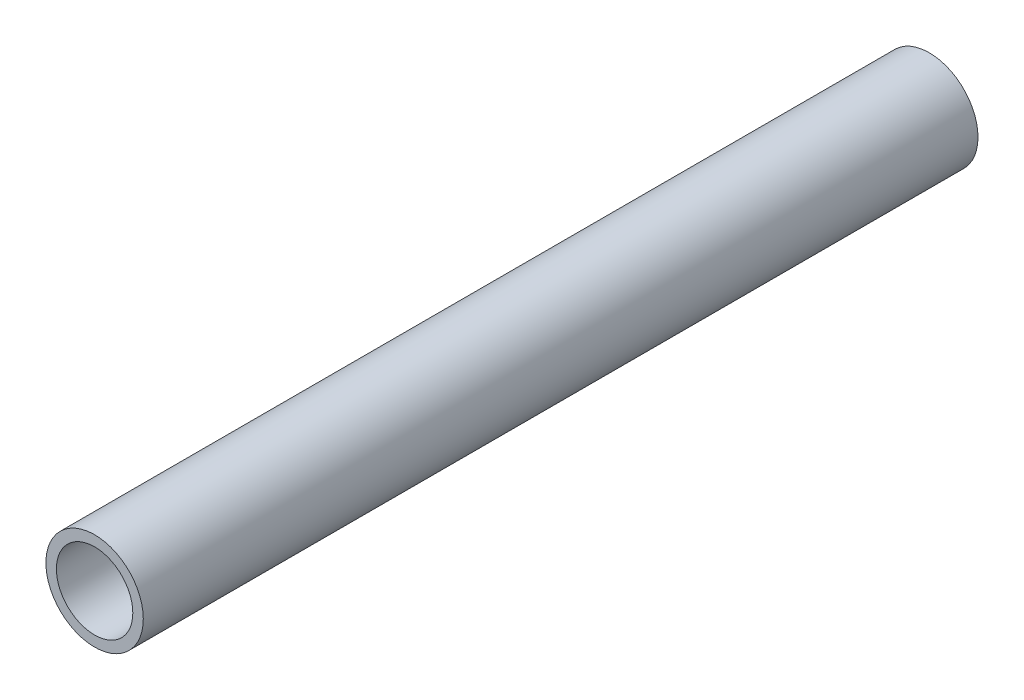
ISO-10303-21;
HEADER;
FILE_DESCRIPTION(('STEP AP214'),'2;1');
FILE_NAME('part.step','',(''),(''),'','','');
FILE_SCHEMA(('AUTOMOTIVE_DESIGN { 1 0 10303 214 1 1 1 1 }'));
ENDSEC;
DATA;
#1=APPLICATION_CONTEXT('core data for automotive mechanical design processes');
#2=APPLICATION_PROTOCOL_DEFINITION('international standard','automotive_design',2000,#1);
#3=PRODUCT_CONTEXT('',#1,'mechanical');
#4=PRODUCT('Part','Part','',(#3));
#5=PRODUCT_RELATED_PRODUCT_CATEGORY('part','',(#4));
#6=PRODUCT_DEFINITION_FORMATION('','',#4);
#7=PRODUCT_DEFINITION_CONTEXT('part definition',#1,'design');
#8=PRODUCT_DEFINITION('design','',#6,#7);
#9=PRODUCT_DEFINITION_SHAPE('','',#8);
#10=(LENGTH_UNIT() NAMED_UNIT(*) SI_UNIT(.MILLI.,.METRE.));
#11=(NAMED_UNIT(*) PLANE_ANGLE_UNIT() SI_UNIT($,.RADIAN.));
#12=(NAMED_UNIT(*) SI_UNIT($,.STERADIAN.) SOLID_ANGLE_UNIT());
#13=UNCERTAINTY_MEASURE_WITH_UNIT(LENGTH_MEASURE(1.E-05),#10,'distance_accuracy_value','');
#14=(GEOMETRIC_REPRESENTATION_CONTEXT(3) GLOBAL_UNCERTAINTY_ASSIGNED_CONTEXT((#13)) GLOBAL_UNIT_ASSIGNED_CONTEXT((#10,
#11,#12)) REPRESENTATION_CONTEXT('',''));
#15=CARTESIAN_POINT('',(0.,0.,0.));
#16=DIRECTION('',(0.,0.,1.));
#17=DIRECTION('',(1.,0.,0.));
#18=AXIS2_PLACEMENT_3D('',#15,#16,#17);
#19=CARTESIAN_POINT('',(0.,0.,228.6));
#20=DIRECTION('',(0.,0.,1.));
#21=DIRECTION('',(1.,0.,0.));
#22=AXIS2_PLACEMENT_3D('',#19,#20,#21);
#23=PLANE('',#22);
#24=CARTESIAN_POINT('',(0.,0.,228.6));
#25=DIRECTION('',(0.,0.,1.));
#26=DIRECTION('',(1.,0.,0.));
#27=AXIS2_PLACEMENT_3D('',#24,#25,#26);
#28=CIRCLE('',#27,13.335);
#29=CARTESIAN_POINT('',(13.335,0.,228.6));
#30=VERTEX_POINT('',#29);
#31=EDGE_CURVE('E10',#30,#30,#28,.T.);
#32=ORIENTED_EDGE('',*,*,#31,.T.);
#33=EDGE_LOOP('',(#32));
#34=FACE_BOUND('',#33,.T.);
#35=CARTESIAN_POINT('',(0.,0.,228.6));
#36=DIRECTION('',(0.,0.,1.));
#37=DIRECTION('',(1.,0.,0.));
#38=AXIS2_PLACEMENT_3D('',#35,#36,#37);
#39=CIRCLE('',#38,10.4648);
#40=CARTESIAN_POINT('',(10.4648,0.,228.6));
#41=VERTEX_POINT('',#40);
#42=EDGE_CURVE('E46',#41,#41,#39,.T.);
#43=ORIENTED_EDGE('',*,*,#42,.F.);
#44=EDGE_LOOP('',(#43));
#45=FACE_BOUND('',#44,.T.);
#46=ADVANCED_FACE('F35',(#34,#45),#23,.T.);
#47=CARTESIAN_POINT('',(0.,0.,0.));
#48=DIRECTION('',(0.,0.,1.));
#49=DIRECTION('',(1.,0.,0.));
#50=AXIS2_PLACEMENT_3D('',#47,#48,#49);
#51=PLANE('',#50);
#52=CARTESIAN_POINT('',(0.,0.,0.));
#53=DIRECTION('',(0.,0.,1.));
#54=DIRECTION('',(1.,0.,0.));
#55=AXIS2_PLACEMENT_3D('',#52,#53,#54);
#56=CIRCLE('',#55,13.335);
#57=CARTESIAN_POINT('',(13.335,0.,0.));
#58=VERTEX_POINT('',#57);
#59=EDGE_CURVE('E39',#58,#58,#56,.T.);
#60=ORIENTED_EDGE('',*,*,#59,.F.);
#61=EDGE_LOOP('',(#60));
#62=FACE_BOUND('',#61,.T.);
#63=CARTESIAN_POINT('',(0.,0.,0.));
#64=DIRECTION('',(0.,0.,1.));
#65=DIRECTION('',(1.,0.,0.));
#66=AXIS2_PLACEMENT_3D('',#63,#64,#65);
#67=CIRCLE('',#66,10.4648);
#68=CARTESIAN_POINT('',(10.4648,0.,0.));
#69=VERTEX_POINT('',#68);
#70=EDGE_CURVE('E48',#69,#69,#67,.T.);
#71=ORIENTED_EDGE('',*,*,#70,.T.);
#72=EDGE_LOOP('',(#71));
#73=FACE_BOUND('',#72,.T.);
#74=ADVANCED_FACE('F58',(#62,#73),#51,.F.);
#75=CARTESIAN_POINT('',(0.,0.,228.6));
#76=DIRECTION('',(0.,0.,-1.));
#77=DIRECTION('',(-1.,0.,0.));
#78=AXIS2_PLACEMENT_3D('',#75,#76,#77);
#79=CYLINDRICAL_SURFACE('',#78,13.335);
#80=ORIENTED_EDGE('',*,*,#31,.F.);
#81=EDGE_LOOP('',(#80));
#82=FACE_BOUND('',#81,.T.);
#83=ORIENTED_EDGE('',*,*,#59,.T.);
#84=EDGE_LOOP('',(#83));
#85=FACE_BOUND('',#84,.T.);
#86=ADVANCED_FACE('F37',(#82,#85),#79,.T.);
#87=CARTESIAN_POINT('',(0.,0.,228.6));
#88=DIRECTION('',(0.,0.,-1.));
#89=DIRECTION('',(-1.,0.,0.));
#90=AXIS2_PLACEMENT_3D('',#87,#88,#89);
#91=CYLINDRICAL_SURFACE('',#90,10.4648);
#92=ORIENTED_EDGE('',*,*,#42,.T.);
#93=EDGE_LOOP('',(#92));
#94=FACE_BOUND('',#93,.T.);
#95=ORIENTED_EDGE('',*,*,#70,.F.);
#96=EDGE_LOOP('',(#95));
#97=FACE_BOUND('',#96,.T.);
#98=ADVANCED_FACE('F54',(#94,#97),#91,.F.);
#99=CLOSED_SHELL('',(#46,#74,#86,#98));
#100=MANIFOLD_SOLID_BREP('B2',#99);
#101=ADVANCED_BREP_SHAPE_REPRESENTATION('',(#18,#100),#14);
#102=SHAPE_DEFINITION_REPRESENTATION(#9,#101);
ENDSEC;
END-ISO-10303-21;
